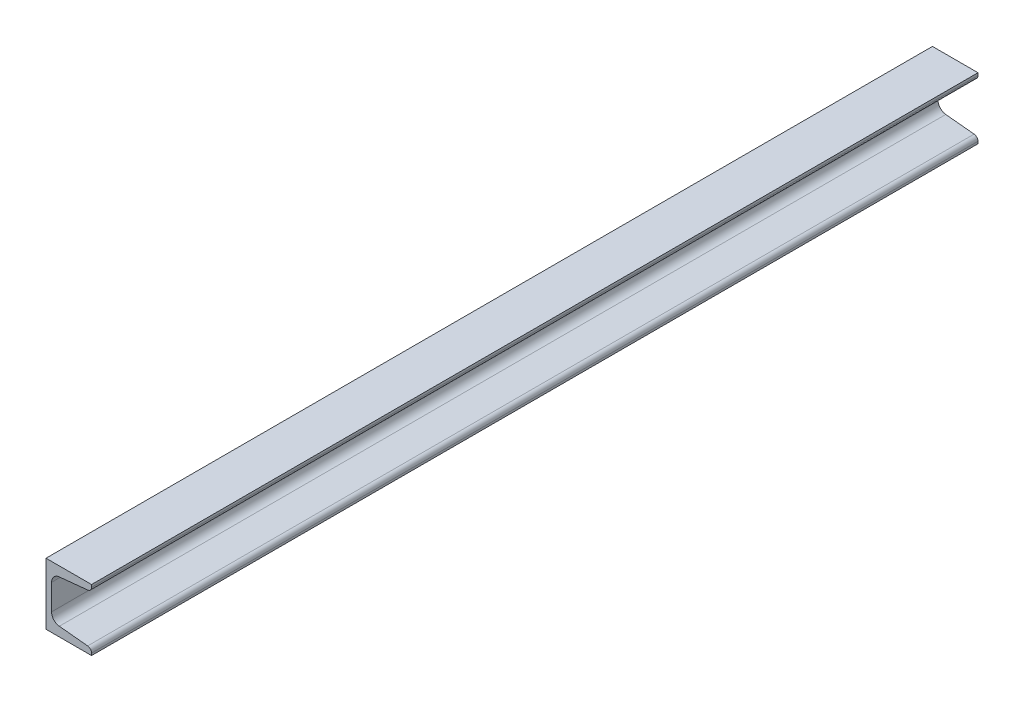
ISO-10303-21;
HEADER;
FILE_DESCRIPTION(('STEP AP214'),'2;1');
FILE_NAME('part.step','',(''),(''),'','','');
FILE_SCHEMA(('AUTOMOTIVE_DESIGN { 1 0 10303 214 1 1 1 1 }'));
ENDSEC;
DATA;
#1=APPLICATION_CONTEXT('core data for automotive mechanical design processes');
#2=APPLICATION_PROTOCOL_DEFINITION('international standard','automotive_design',2000,#1);
#3=PRODUCT_CONTEXT('',#1,'mechanical');
#4=PRODUCT('Part','Part','',(#3));
#5=PRODUCT_RELATED_PRODUCT_CATEGORY('part','',(#4));
#6=PRODUCT_DEFINITION_FORMATION('','',#4);
#7=PRODUCT_DEFINITION_CONTEXT('part definition',#1,'design');
#8=PRODUCT_DEFINITION('design','',#6,#7);
#9=PRODUCT_DEFINITION_SHAPE('','',#8);
#10=(LENGTH_UNIT() NAMED_UNIT(*) SI_UNIT(.MILLI.,.METRE.));
#11=(NAMED_UNIT(*) PLANE_ANGLE_UNIT() SI_UNIT($,.RADIAN.));
#12=(NAMED_UNIT(*) SI_UNIT($,.STERADIAN.) SOLID_ANGLE_UNIT());
#13=UNCERTAINTY_MEASURE_WITH_UNIT(LENGTH_MEASURE(1.E-05),#10,'distance_accuracy_value','');
#14=(GEOMETRIC_REPRESENTATION_CONTEXT(3) GLOBAL_UNCERTAINTY_ASSIGNED_CONTEXT((#13)) GLOBAL_UNIT_ASSIGNED_CONTEXT((#10,
#11,#12)) REPRESENTATION_CONTEXT('',''));
#15=CARTESIAN_POINT('',(0.,0.,0.));
#16=DIRECTION('',(0.,0.,1.));
#17=DIRECTION('',(1.,0.,0.));
#18=AXIS2_PLACEMENT_3D('',#15,#16,#17);
#19=CARTESIAN_POINT('',(0.,0.,720.));
#20=DIRECTION('',(0.,1.,0.));
#21=DIRECTION('',(0.,0.,1.));
#22=AXIS2_PLACEMENT_3D('',#19,#20,#21);
#23=PLANE('',#22);
#24=DIRECTION('',(1.,0.,0.));
#25=VECTOR('',#24,1.);
#26=CARTESIAN_POINT('',(0.,0.,0.));
#27=LINE('',#26,#25);
#28=CARTESIAN_POINT('',(0.,0.,0.));
#29=VERTEX_POINT('',#28);
#30=CARTESIAN_POINT('',(37.,0.,0.));
#31=VERTEX_POINT('',#30);
#32=EDGE_CURVE('E156',#29,#31,#27,.T.);
#33=ORIENTED_EDGE('',*,*,#32,.T.);
#34=DIRECTION('',(0.,0.,-1.));
#35=VECTOR('',#34,1.);
#36=CARTESIAN_POINT('',(37.,0.,720.));
#37=LINE('',#36,#35);
#38=CARTESIAN_POINT('',(37.,0.,720.));
#39=VERTEX_POINT('',#38);
#40=EDGE_CURVE('E11',#39,#31,#37,.T.);
#41=ORIENTED_EDGE('',*,*,#40,.F.);
#42=DIRECTION('',(1.,0.,0.));
#43=VECTOR('',#42,1.);
#44=CARTESIAN_POINT('',(0.,0.,720.));
#45=LINE('',#44,#43);
#46=CARTESIAN_POINT('',(0.,0.,720.));
#47=VERTEX_POINT('',#46);
#48=EDGE_CURVE('E178',#47,#39,#45,.T.);
#49=ORIENTED_EDGE('',*,*,#48,.F.);
#50=DIRECTION('',(0.,0.,-1.));
#51=VECTOR('',#50,1.);
#52=CARTESIAN_POINT('',(0.,0.,720.));
#53=LINE('',#52,#51);
#54=EDGE_CURVE('E152',#47,#29,#53,.T.);
#55=ORIENTED_EDGE('',*,*,#54,.T.);
#56=EDGE_LOOP('',(#33,#41,#49,#55));
#57=FACE_BOUND('',#56,.T.);
#58=ADVANCED_FACE('F36',(#57),#23,.F.);
#59=CARTESIAN_POINT('',(37.,0.,720.));
#60=DIRECTION('',(-1.,0.,0.));
#61=DIRECTION('',(0.,0.,1.));
#62=AXIS2_PLACEMENT_3D('',#59,#60,#61);
#63=PLANE('',#62);
#64=DIRECTION('',(0.,1.,0.));
#65=VECTOR('',#64,1.);
#66=CARTESIAN_POINT('',(37.,0.,0.));
#67=LINE('',#66,#65);
#68=CARTESIAN_POINT('',(37.,1.75754353260767,0.));
#69=VERTEX_POINT('',#68);
#70=EDGE_CURVE('E159',#31,#69,#67,.T.);
#71=ORIENTED_EDGE('',*,*,#70,.T.);
#72=DIRECTION('',(0.,0.,-1.));
#73=VECTOR('',#72,1.);
#74=CARTESIAN_POINT('',(37.,1.75754353260767,720.));
#75=LINE('',#74,#73);
#76=CARTESIAN_POINT('',(37.,1.75754353260767,720.));
#77=VERTEX_POINT('',#76);
#78=EDGE_CURVE('E44',#77,#69,#75,.T.);
#79=ORIENTED_EDGE('',*,*,#78,.F.);
#80=DIRECTION('',(0.,1.,0.));
#81=VECTOR('',#80,1.);
#82=CARTESIAN_POINT('',(37.,0.,720.));
#83=LINE('',#82,#81);
#84=EDGE_CURVE('E107',#39,#77,#83,.T.);
#85=ORIENTED_EDGE('',*,*,#84,.F.);
#86=ORIENTED_EDGE('',*,*,#40,.T.);
#87=EDGE_LOOP('',(#71,#79,#85,#86));
#88=FACE_BOUND('',#87,.T.);
#89=ADVANCED_FACE('F256',(#88),#63,.F.);
#90=CARTESIAN_POINT('',(33.5,1.75754353260769,720.));
#91=DIRECTION('',(0.,0.,-1.));
#92=DIRECTION('',(-1.,0.,0.));
#93=AXIS2_PLACEMENT_3D('',#90,#91,#92);
#94=CYLINDRICAL_SURFACE('',#93,3.5);
#95=CARTESIAN_POINT('',(33.5,1.75754353260769,0.));
#96=DIRECTION('',(0.,0.,1.));
#97=DIRECTION('',(1.,0.,0.));
#98=AXIS2_PLACEMENT_3D('',#95,#96,#97);
#99=CIRCLE('',#98,3.5);
#100=CARTESIAN_POINT('',(33.8482630165735,5.24017369834266,0.));
#101=VERTEX_POINT('',#100);
#102=EDGE_CURVE('E161',#69,#101,#99,.T.);
#103=ORIENTED_EDGE('',*,*,#102,.T.);
#104=DIRECTION('',(0.,0.,-1.));
#105=VECTOR('',#104,1.);
#106=CARTESIAN_POINT('',(33.8482630165735,5.24017369834266,720.));
#107=LINE('',#106,#105);
#108=CARTESIAN_POINT('',(33.8482630165735,5.24017369834266,720.));
#109=VERTEX_POINT('',#108);
#110=EDGE_CURVE('E197',#109,#101,#107,.T.);
#111=ORIENTED_EDGE('',*,*,#110,.F.);
#112=CARTESIAN_POINT('',(33.5,1.75754353260769,720.));
#113=DIRECTION('',(0.,0.,1.));
#114=DIRECTION('',(1.,0.,0.));
#115=AXIS2_PLACEMENT_3D('',#112,#113,#114);
#116=CIRCLE('',#115,3.5);
#117=EDGE_CURVE('E205',#77,#109,#116,.T.);
#118=ORIENTED_EDGE('',*,*,#117,.F.);
#119=ORIENTED_EDGE('',*,*,#78,.T.);
#120=EDGE_LOOP('',(#103,#111,#118,#119));
#121=FACE_BOUND('',#120,.T.);
#122=ADVANCED_FACE('F203',(#121),#94,.T.);
#123=CARTESIAN_POINT('',(10.8034739668531,7.5446526033147,720.));
#124=DIRECTION('',(-0.0995037190209989,-0.995037190209989,0.));
#125=DIRECTION('',(0.995037190209989,-0.099503719020999,0.));
#126=AXIS2_PLACEMENT_3D('',#123,#124,#125);
#127=PLANE('',#126);
#128=DIRECTION('',(-0.995037190209989,0.0995037190209989,0.));
#129=VECTOR('',#128,1.);
#130=CARTESIAN_POINT('',(10.8034739668531,7.5446526033147,0.));
#131=LINE('',#130,#129);
#132=CARTESIAN_POINT('',(10.8034739668531,7.5446526033147,0.));
#133=VERTEX_POINT('',#132);
#134=EDGE_CURVE('E163',#101,#133,#131,.T.);
#135=ORIENTED_EDGE('',*,*,#134,.T.);
#136=DIRECTION('',(0.,0.,-1.));
#137=VECTOR('',#136,1.);
#138=CARTESIAN_POINT('',(10.8034739668531,7.5446526033147,720.));
#139=LINE('',#138,#137);
#140=CARTESIAN_POINT('',(10.8034739668531,7.5446526033147,720.));
#141=VERTEX_POINT('',#140);
#142=EDGE_CURVE('E194',#141,#133,#139,.T.);
#143=ORIENTED_EDGE('',*,*,#142,.F.);
#144=DIRECTION('',(-0.995037190209989,0.0995037190209989,0.));
#145=VECTOR('',#144,1.);
#146=CARTESIAN_POINT('',(10.8034739668531,7.5446526033147,720.));
#147=LINE('',#146,#145);
#148=EDGE_CURVE('E223',#109,#141,#147,.T.);
#149=ORIENTED_EDGE('',*,*,#148,.F.);
#150=ORIENTED_EDGE('',*,*,#110,.T.);
#151=EDGE_LOOP('',(#135,#143,#149,#150));
#152=FACE_BOUND('',#151,.T.);
#153=ADVANCED_FACE('F214',(#152),#127,.F.);
#154=CARTESIAN_POINT('',(11.5,14.5099129347846,720.));
#155=DIRECTION('',(0.,0.,-1.));
#156=DIRECTION('',(-1.,0.,0.));
#157=AXIS2_PLACEMENT_3D('',#154,#155,#156);
#158=CYLINDRICAL_SURFACE('',#157,7.);
#159=CARTESIAN_POINT('',(11.5,14.5099129347846,0.));
#160=DIRECTION('',(0.,0.,-1.));
#161=DIRECTION('',(1.,0.,0.));
#162=AXIS2_PLACEMENT_3D('',#159,#160,#161);
#163=CIRCLE('',#162,7.);
#164=CARTESIAN_POINT('',(4.5,14.5099129347847,0.));
#165=VERTEX_POINT('',#164);
#166=EDGE_CURVE('E165',#133,#165,#163,.T.);
#167=ORIENTED_EDGE('',*,*,#166,.T.);
#168=DIRECTION('',(0.,0.,-1.));
#169=VECTOR('',#168,1.);
#170=CARTESIAN_POINT('',(4.5,14.5099129347847,720.));
#171=LINE('',#170,#169);
#172=CARTESIAN_POINT('',(4.5,14.5099129347847,720.));
#173=VERTEX_POINT('',#172);
#174=EDGE_CURVE('E191',#173,#165,#171,.T.);
#175=ORIENTED_EDGE('',*,*,#174,.F.);
#176=CARTESIAN_POINT('',(11.5,14.5099129347846,720.));
#177=DIRECTION('',(0.,0.,-1.));
#178=DIRECTION('',(1.,0.,0.));
#179=AXIS2_PLACEMENT_3D('',#176,#177,#178);
#180=CIRCLE('',#179,7.);
#181=EDGE_CURVE('E220',#141,#173,#180,.T.);
#182=ORIENTED_EDGE('',*,*,#181,.F.);
#183=ORIENTED_EDGE('',*,*,#142,.T.);
#184=EDGE_LOOP('',(#167,#175,#182,#183));
#185=FACE_BOUND('',#184,.T.);
#186=ADVANCED_FACE('F218',(#185),#158,.F.);
#187=CARTESIAN_POINT('',(4.5,14.5099129347847,720.));
#188=DIRECTION('',(-1.,0.,0.));
#189=DIRECTION('',(0.,-1.,0.));
#190=AXIS2_PLACEMENT_3D('',#187,#188,#189);
#191=PLANE('',#190);
#192=DIRECTION('',(0.,1.,0.));
#193=VECTOR('',#192,1.);
#194=CARTESIAN_POINT('',(4.5,14.5099129347847,0.));
#195=LINE('',#194,#193);
#196=CARTESIAN_POINT('',(4.5,35.2876429963102,0.));
#197=VERTEX_POINT('',#196);
#198=EDGE_CURVE('E167',#165,#197,#195,.T.);
#199=ORIENTED_EDGE('',*,*,#198,.T.);
#200=DIRECTION('',(0.,0.,-1.));
#201=VECTOR('',#200,1.);
#202=CARTESIAN_POINT('',(4.5,35.2876429963102,720.));
#203=LINE('',#202,#201);
#204=CARTESIAN_POINT('',(4.5,35.2876429963102,720.));
#205=VERTEX_POINT('',#204);
#206=EDGE_CURVE('E188',#205,#197,#203,.T.);
#207=ORIENTED_EDGE('',*,*,#206,.F.);
#208=DIRECTION('',(0.,1.,0.));
#209=VECTOR('',#208,1.);
#210=CARTESIAN_POINT('',(4.5,14.5099129347847,720.));
#211=LINE('',#210,#209);
#212=EDGE_CURVE('E222',#173,#205,#211,.T.);
#213=ORIENTED_EDGE('',*,*,#212,.F.);
#214=ORIENTED_EDGE('',*,*,#174,.T.);
#215=EDGE_LOOP('',(#199,#207,#213,#214));
#216=FACE_BOUND('',#215,.T.);
#217=ADVANCED_FACE('F269',(#216),#191,.F.);
#218=CARTESIAN_POINT('',(11.5,35.2876429963103,720.));
#219=DIRECTION('',(0.,0.,-1.));
#220=DIRECTION('',(-1.,0.,0.));
#221=AXIS2_PLACEMENT_3D('',#218,#219,#220);
#222=CYLINDRICAL_SURFACE('',#221,7.);
#223=CARTESIAN_POINT('',(11.5,35.2876429963103,0.));
#224=DIRECTION('',(0.,0.,-1.));
#225=DIRECTION('',(1.,0.,0.));
#226=AXIS2_PLACEMENT_3D('',#223,#224,#225);
#227=CIRCLE('',#226,7.);
#228=CARTESIAN_POINT('',(10.803473966853,42.2529033277802,0.));
#229=VERTEX_POINT('',#228);
#230=EDGE_CURVE('E169',#197,#229,#227,.T.);
#231=ORIENTED_EDGE('',*,*,#230,.T.);
#232=DIRECTION('',(0.,0.,-1.));
#233=VECTOR('',#232,1.);
#234=CARTESIAN_POINT('',(10.803473966853,42.2529033277802,720.));
#235=LINE('',#234,#233);
#236=CARTESIAN_POINT('',(10.803473966853,42.2529033277802,720.));
#237=VERTEX_POINT('',#236);
#238=EDGE_CURVE('E185',#237,#229,#235,.T.);
#239=ORIENTED_EDGE('',*,*,#238,.F.);
#240=CARTESIAN_POINT('',(11.5,35.2876429963103,720.));
#241=DIRECTION('',(0.,0.,-1.));
#242=DIRECTION('',(1.,0.,0.));
#243=AXIS2_PLACEMENT_3D('',#240,#241,#242);
#244=CIRCLE('',#243,7.);
#245=EDGE_CURVE('E225',#205,#237,#244,.T.);
#246=ORIENTED_EDGE('',*,*,#245,.F.);
#247=ORIENTED_EDGE('',*,*,#206,.T.);
#248=EDGE_LOOP('',(#231,#239,#246,#247));
#249=FACE_BOUND('',#248,.T.);
#250=ADVANCED_FACE('F272',(#249),#222,.F.);
#251=CARTESIAN_POINT('',(10.803473966853,42.2529033277802,720.));
#252=DIRECTION('',(-0.0995037190209989,0.995037190209989,0.));
#253=DIRECTION('',(-0.995037190209989,-0.0995037190209989,0.));
#254=AXIS2_PLACEMENT_3D('',#251,#252,#253);
#255=PLANE('',#254);
#256=DIRECTION('',(0.995037190209989,0.0995037190209989,0.));
#257=VECTOR('',#256,1.);
#258=CARTESIAN_POINT('',(10.803473966853,42.2529033277802,0.));
#259=LINE('',#258,#257);
#260=CARTESIAN_POINT('',(33.8482630165735,44.5573822327522,0.));
#261=VERTEX_POINT('',#260);
#262=EDGE_CURVE('E171',#229,#261,#259,.T.);
#263=ORIENTED_EDGE('',*,*,#262,.T.);
#264=DIRECTION('',(0.,0.,-1.));
#265=VECTOR('',#264,1.);
#266=CARTESIAN_POINT('',(33.8482630165735,44.5573822327522,720.));
#267=LINE('',#266,#265);
#268=CARTESIAN_POINT('',(33.8482630165735,44.5573822327522,720.));
#269=VERTEX_POINT('',#268);
#270=EDGE_CURVE('E182',#269,#261,#267,.T.);
#271=ORIENTED_EDGE('',*,*,#270,.F.);
#272=DIRECTION('',(0.995037190209989,0.0995037190209989,0.));
#273=VECTOR('',#272,1.);
#274=CARTESIAN_POINT('',(10.803473966853,42.2529033277802,720.));
#275=LINE('',#274,#273);
#276=EDGE_CURVE('E231',#237,#269,#275,.T.);
#277=ORIENTED_EDGE('',*,*,#276,.F.);
#278=ORIENTED_EDGE('',*,*,#238,.T.);
#279=EDGE_LOOP('',(#263,#271,#277,#278));
#280=FACE_BOUND('',#279,.T.);
#281=ADVANCED_FACE('F237',(#280),#255,.F.);
#282=CARTESIAN_POINT('',(33.5,48.0400123984872,720.));
#283=DIRECTION('',(0.,0.,-1.));
#284=DIRECTION('',(-1.,0.,0.));
#285=AXIS2_PLACEMENT_3D('',#282,#283,#284);
#286=CYLINDRICAL_SURFACE('',#285,3.50000000000001);
#287=CARTESIAN_POINT('',(33.5,48.0400123984872,0.));
#288=DIRECTION('',(0.,0.,1.));
#289=DIRECTION('',(1.,0.,0.));
#290=AXIS2_PLACEMENT_3D('',#287,#288,#289);
#291=CIRCLE('',#290,3.50000000000001);
#292=CARTESIAN_POINT('',(37.,48.0400123984872,0.));
#293=VERTEX_POINT('',#292);
#294=EDGE_CURVE('E173',#261,#293,#291,.T.);
#295=ORIENTED_EDGE('',*,*,#294,.T.);
#296=DIRECTION('',(0.,0.,-1.));
#297=VECTOR('',#296,1.);
#298=CARTESIAN_POINT('',(37.,48.0400123984872,720.));
#299=LINE('',#298,#297);
#300=CARTESIAN_POINT('',(37.,48.0400123984872,720.));
#301=VERTEX_POINT('',#300);
#302=EDGE_CURVE('E147',#301,#293,#299,.T.);
#303=ORIENTED_EDGE('',*,*,#302,.F.);
#304=CARTESIAN_POINT('',(33.5,48.0400123984872,720.));
#305=DIRECTION('',(0.,0.,1.));
#306=DIRECTION('',(1.,0.,0.));
#307=AXIS2_PLACEMENT_3D('',#304,#305,#306);
#308=CIRCLE('',#307,3.50000000000001);
#309=EDGE_CURVE('E138',#269,#301,#308,.T.);
#310=ORIENTED_EDGE('',*,*,#309,.F.);
#311=ORIENTED_EDGE('',*,*,#270,.T.);
#312=EDGE_LOOP('',(#295,#303,#310,#311));
#313=FACE_BOUND('',#312,.T.);
#314=ADVANCED_FACE('F241',(#313),#286,.T.);
#315=CARTESIAN_POINT('',(37.,48.0400123984872,720.));
#316=DIRECTION('',(-1.,0.,0.));
#317=DIRECTION('',(0.,0.,1.));
#318=AXIS2_PLACEMENT_3D('',#315,#316,#317);
#319=PLANE('',#318);
#320=DIRECTION('',(0.,1.,0.));
#321=VECTOR('',#320,1.);
#322=CARTESIAN_POINT('',(37.,48.0400123984872,0.));
#323=LINE('',#322,#321);
#324=CARTESIAN_POINT('',(37.,50.,0.));
#325=VERTEX_POINT('',#324);
#326=EDGE_CURVE('E146',#293,#325,#323,.T.);
#327=ORIENTED_EDGE('',*,*,#326,.T.);
#328=DIRECTION('',(0.,0.,-1.));
#329=VECTOR('',#328,1.);
#330=CARTESIAN_POINT('',(37.,50.,720.));
#331=LINE('',#330,#329);
#332=CARTESIAN_POINT('',(37.,50.,720.));
#333=VERTEX_POINT('',#332);
#334=EDGE_CURVE('E143',#333,#325,#331,.T.);
#335=ORIENTED_EDGE('',*,*,#334,.F.);
#336=DIRECTION('',(0.,1.,0.));
#337=VECTOR('',#336,1.);
#338=CARTESIAN_POINT('',(37.,48.0400123984872,720.));
#339=LINE('',#338,#337);
#340=EDGE_CURVE('E132',#301,#333,#339,.T.);
#341=ORIENTED_EDGE('',*,*,#340,.F.);
#342=ORIENTED_EDGE('',*,*,#302,.T.);
#343=EDGE_LOOP('',(#327,#335,#341,#342));
#344=FACE_BOUND('',#343,.T.);
#345=ADVANCED_FACE('F144',(#344),#319,.F.);
#346=CARTESIAN_POINT('',(-1.71512449944288E-13,50.,720.));
#347=DIRECTION('',(0.,-1.,0.));
#348=DIRECTION('',(0.,0.,-1.));
#349=AXIS2_PLACEMENT_3D('',#346,#347,#348);
#350=PLANE('',#349);
#351=DIRECTION('',(-1.,0.,0.));
#352=VECTOR('',#351,1.);
#353=CARTESIAN_POINT('',(-1.71512449944288E-13,50.,0.));
#354=LINE('',#353,#352);
#355=CARTESIAN_POINT('',(-1.71512449944288E-13,50.,0.));
#356=VERTEX_POINT('',#355);
#357=EDGE_CURVE('E93',#325,#356,#354,.T.);
#358=ORIENTED_EDGE('',*,*,#357,.T.);
#359=DIRECTION('',(0.,0.,-1.));
#360=VECTOR('',#359,1.);
#361=CARTESIAN_POINT('',(-1.71512449944288E-13,50.,720.));
#362=LINE('',#361,#360);
#363=CARTESIAN_POINT('',(-1.71512449944288E-13,50.,720.));
#364=VERTEX_POINT('',#363);
#365=EDGE_CURVE('E148',#364,#356,#362,.T.);
#366=ORIENTED_EDGE('',*,*,#365,.F.);
#367=DIRECTION('',(-1.,0.,0.));
#368=VECTOR('',#367,1.);
#369=CARTESIAN_POINT('',(-1.71512449944288E-13,50.,720.));
#370=LINE('',#369,#368);
#371=EDGE_CURVE('E136',#333,#364,#370,.T.);
#372=ORIENTED_EDGE('',*,*,#371,.F.);
#373=ORIENTED_EDGE('',*,*,#334,.T.);
#374=EDGE_LOOP('',(#358,#366,#372,#373));
#375=FACE_BOUND('',#374,.T.);
#376=ADVANCED_FACE('F150',(#375),#350,.F.);
#377=CARTESIAN_POINT('',(0.,0.,720.));
#378=DIRECTION('',(1.,0.,0.));
#379=DIRECTION('',(0.,1.,0.));
#380=AXIS2_PLACEMENT_3D('',#377,#378,#379);
#381=PLANE('',#380);
#382=DIRECTION('',(0.,-1.,0.));
#383=VECTOR('',#382,1.);
#384=CARTESIAN_POINT('',(0.,0.,0.));
#385=LINE('',#384,#383);
#386=EDGE_CURVE('E99',#356,#29,#385,.T.);
#387=ORIENTED_EDGE('',*,*,#386,.T.);
#388=ORIENTED_EDGE('',*,*,#54,.F.);
#389=DIRECTION('',(0.,-1.,0.));
#390=VECTOR('',#389,1.);
#391=CARTESIAN_POINT('',(0.,0.,720.));
#392=LINE('',#391,#390);
#393=EDGE_CURVE('E52',#364,#47,#392,.T.);
#394=ORIENTED_EDGE('',*,*,#393,.F.);
#395=ORIENTED_EDGE('',*,*,#365,.T.);
#396=EDGE_LOOP('',(#387,#388,#394,#395));
#397=FACE_BOUND('',#396,.T.);
#398=ADVANCED_FACE('F245',(#397),#381,.F.);
#399=CARTESIAN_POINT('',(33.5,1.75754353260769,720.));
#400=DIRECTION('',(0.,0.,1.));
#401=DIRECTION('',(1.,0.,0.));
#402=AXIS2_PLACEMENT_3D('',#399,#400,#401);
#403=PLANE('',#402);
#404=ORIENTED_EDGE('',*,*,#48,.T.);
#405=ORIENTED_EDGE('',*,*,#84,.T.);
#406=ORIENTED_EDGE('',*,*,#117,.T.);
#407=ORIENTED_EDGE('',*,*,#148,.T.);
#408=ORIENTED_EDGE('',*,*,#181,.T.);
#409=ORIENTED_EDGE('',*,*,#212,.T.);
#410=ORIENTED_EDGE('',*,*,#245,.T.);
#411=ORIENTED_EDGE('',*,*,#276,.T.);
#412=ORIENTED_EDGE('',*,*,#309,.T.);
#413=ORIENTED_EDGE('',*,*,#340,.T.);
#414=ORIENTED_EDGE('',*,*,#371,.T.);
#415=ORIENTED_EDGE('',*,*,#393,.T.);
#416=EDGE_LOOP('',(#404,#405,#406,#407,#408,#409,#410,#411,#412,#413,#414,#415));
#417=FACE_BOUND('',#416,.T.);
#418=ADVANCED_FACE('F134',(#417),#403,.T.);
#419=CARTESIAN_POINT('',(33.5,1.75754353260769,0.));
#420=DIRECTION('',(0.,0.,1.));
#421=DIRECTION('',(1.,0.,0.));
#422=AXIS2_PLACEMENT_3D('',#419,#420,#421);
#423=PLANE('',#422);
#424=ORIENTED_EDGE('',*,*,#32,.F.);
#425=ORIENTED_EDGE('',*,*,#386,.F.);
#426=ORIENTED_EDGE('',*,*,#357,.F.);
#427=ORIENTED_EDGE('',*,*,#326,.F.);
#428=ORIENTED_EDGE('',*,*,#294,.F.);
#429=ORIENTED_EDGE('',*,*,#262,.F.);
#430=ORIENTED_EDGE('',*,*,#230,.F.);
#431=ORIENTED_EDGE('',*,*,#198,.F.);
#432=ORIENTED_EDGE('',*,*,#166,.F.);
#433=ORIENTED_EDGE('',*,*,#134,.F.);
#434=ORIENTED_EDGE('',*,*,#102,.F.);
#435=ORIENTED_EDGE('',*,*,#70,.F.);
#436=EDGE_LOOP('',(#424,#425,#426,#427,#428,#429,#430,#431,#432,#433,#434,#435));
#437=FACE_BOUND('',#436,.T.);
#438=ADVANCED_FACE('F209',(#437),#423,.F.);
#439=CLOSED_SHELL('',(#58,#89,#122,#153,#186,#217,#250,#281,#314,#345,#376,#398,#418,#438));
#440=MANIFOLD_SOLID_BREP('B2',#439);
#441=ADVANCED_BREP_SHAPE_REPRESENTATION('',(#18,#440),#14);
#442=SHAPE_DEFINITION_REPRESENTATION(#9,#441);
ENDSEC;
END-ISO-10303-21;
